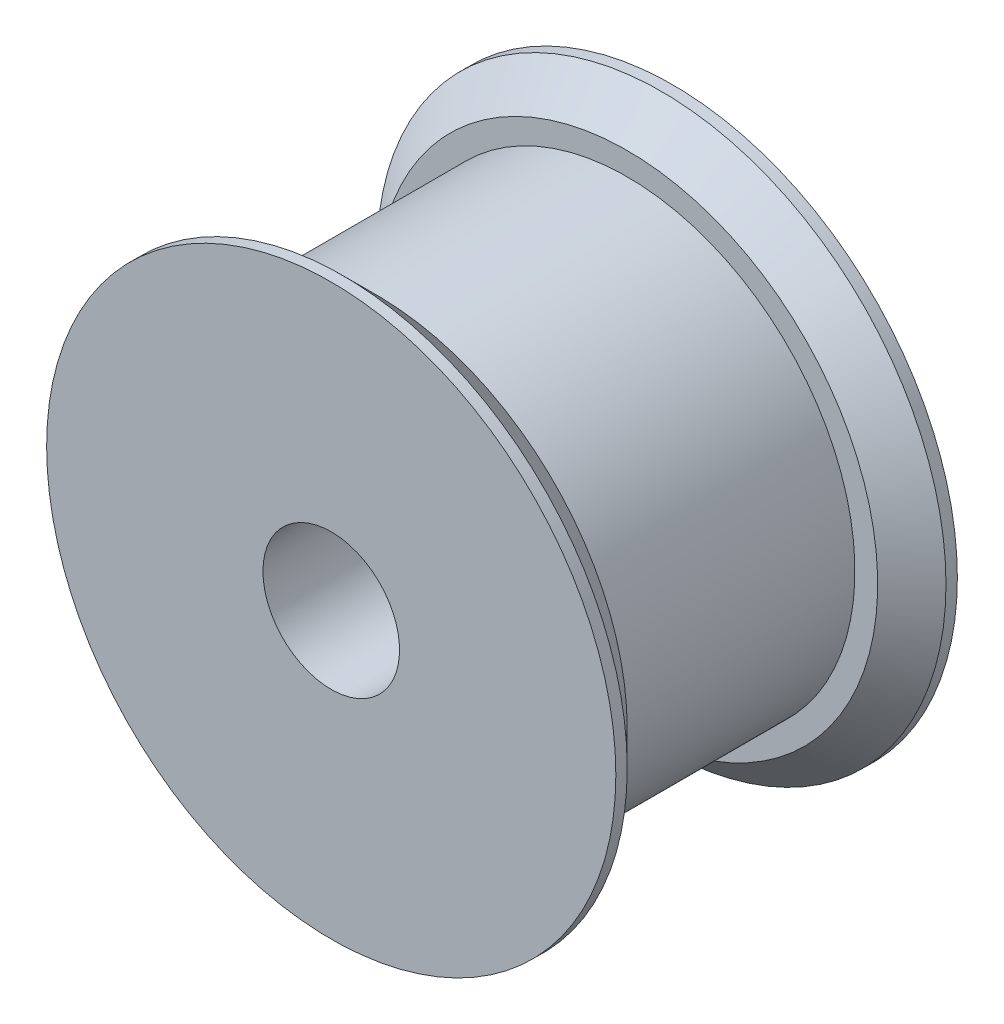
ISO-10303-21;
HEADER;
FILE_DESCRIPTION(('STEP AP214'),'2;1');
FILE_NAME('part.step','',(''),(''),'','','');
FILE_SCHEMA(('AUTOMOTIVE_DESIGN { 1 0 10303 214 1 1 1 1 }'));
ENDSEC;
DATA;
#1=APPLICATION_CONTEXT('core data for automotive mechanical design processes');
#2=APPLICATION_PROTOCOL_DEFINITION('international standard','automotive_design',2000,#1);
#3=PRODUCT_CONTEXT('',#1,'mechanical');
#4=PRODUCT('Part','Part','',(#3));
#5=PRODUCT_RELATED_PRODUCT_CATEGORY('part','',(#4));
#6=PRODUCT_DEFINITION_FORMATION('','',#4);
#7=PRODUCT_DEFINITION_CONTEXT('part definition',#1,'design');
#8=PRODUCT_DEFINITION('design','',#6,#7);
#9=PRODUCT_DEFINITION_SHAPE('','',#8);
#10=(LENGTH_UNIT() NAMED_UNIT(*) SI_UNIT(.MILLI.,.METRE.));
#11=(NAMED_UNIT(*) PLANE_ANGLE_UNIT() SI_UNIT($,.RADIAN.));
#12=(NAMED_UNIT(*) SI_UNIT($,.STERADIAN.) SOLID_ANGLE_UNIT());
#13=UNCERTAINTY_MEASURE_WITH_UNIT(LENGTH_MEASURE(1.E-05),#10,'distance_accuracy_value','');
#14=(GEOMETRIC_REPRESENTATION_CONTEXT(3) GLOBAL_UNCERTAINTY_ASSIGNED_CONTEXT((#13)) GLOBAL_UNIT_ASSIGNED_CONTEXT((#10,
#11,#12)) REPRESENTATION_CONTEXT('',''));
#15=CARTESIAN_POINT('',(0.,0.,0.));
#16=DIRECTION('',(0.,0.,1.));
#17=DIRECTION('',(1.,0.,0.));
#18=AXIS2_PLACEMENT_3D('',#15,#16,#17);
#19=CARTESIAN_POINT('',(0.,0.,7.5));
#20=DIRECTION('',(0.,0.,-1.));
#21=DIRECTION('',(-1.,0.,0.));
#22=AXIS2_PLACEMENT_3D('',#19,#20,#21);
#23=PLANE('',#22);
#24=CARTESIAN_POINT('',(0.,0.,7.5));
#25=DIRECTION('',(0.,0.,-1.));
#26=DIRECTION('',(-1.,0.,0.));
#27=AXIS2_PLACEMENT_3D('',#24,#25,#26);
#28=CIRCLE('',#27,3.);
#29=CARTESIAN_POINT('',(-3.,0.,7.5));
#30=VERTEX_POINT('',#29);
#31=EDGE_CURVE('E80',#30,#30,#28,.T.);
#32=ORIENTED_EDGE('',*,*,#31,.T.);
#33=EDGE_LOOP('',(#32));
#34=FACE_BOUND('',#33,.T.);
#35=CARTESIAN_POINT('',(0.,0.,7.5));
#36=DIRECTION('',(0.,0.,-1.));
#37=DIRECTION('',(-1.,0.,0.));
#38=AXIS2_PLACEMENT_3D('',#35,#36,#37);
#39=CIRCLE('',#38,12.5);
#40=CARTESIAN_POINT('',(-12.5,0.,7.5));
#41=VERTEX_POINT('',#40);
#42=EDGE_CURVE('E64',#41,#41,#39,.T.);
#43=ORIENTED_EDGE('',*,*,#42,.F.);
#44=EDGE_LOOP('',(#43));
#45=FACE_BOUND('',#44,.T.);
#46=ADVANCED_FACE('F39',(#34,#45),#23,.F.);
#47=CARTESIAN_POINT('',(0.,0.,-16.7008196721311));
#48=DIRECTION('',(0.,0.,-1.));
#49=DIRECTION('',(-1.,0.,0.));
#50=AXIS2_PLACEMENT_3D('',#47,#48,#49);
#51=CYLINDRICAL_SURFACE('',#50,12.5);
#52=CARTESIAN_POINT('',(0.,0.,7.00000000000001));
#53=DIRECTION('',(0.,0.,1.));
#54=DIRECTION('',(1.,0.,0.));
#55=AXIS2_PLACEMENT_3D('',#52,#53,#54);
#56=CIRCLE('',#55,12.5);
#57=CARTESIAN_POINT('',(12.5,0.,7.00000000000001));
#58=VERTEX_POINT('',#57);
#59=EDGE_CURVE('E10',#58,#58,#56,.T.);
#60=ORIENTED_EDGE('',*,*,#59,.T.);
#61=EDGE_LOOP('',(#60));
#62=FACE_BOUND('',#61,.T.);
#63=ORIENTED_EDGE('',*,*,#42,.T.);
#64=EDGE_LOOP('',(#63));
#65=FACE_BOUND('',#64,.T.);
#66=ADVANCED_FACE('F116',(#62,#65),#51,.T.);
#67=CARTESIAN_POINT('',(12.5,0.,5.5));
#68=DIRECTION('',(0.,0.,1.));
#69=DIRECTION('',(1.,0.,0.));
#70=AXIS2_PLACEMENT_3D('',#67,#68,#69);
#71=PLANE('',#70);
#72=CARTESIAN_POINT('',(0.,0.,5.5));
#73=DIRECTION('',(0.,0.,1.));
#74=DIRECTION('',(1.,0.,0.));
#75=AXIS2_PLACEMENT_3D('',#72,#73,#74);
#76=CIRCLE('',#75,11.);
#77=CARTESIAN_POINT('',(11.,0.,5.5));
#78=VERTEX_POINT('',#77);
#79=EDGE_CURVE('E48',#78,#78,#76,.F.);
#80=ORIENTED_EDGE('',*,*,#79,.T.);
#81=EDGE_LOOP('',(#80));
#82=FACE_BOUND('',#81,.T.);
#83=CARTESIAN_POINT('',(0.,0.,5.5));
#84=DIRECTION('',(0.,0.,-1.));
#85=DIRECTION('',(-1.,0.,0.));
#86=AXIS2_PLACEMENT_3D('',#83,#84,#85);
#87=CIRCLE('',#86,10.);
#88=CARTESIAN_POINT('',(-10.,0.,5.5));
#89=VERTEX_POINT('',#88);
#90=EDGE_CURVE('E68',#89,#89,#87,.T.);
#91=ORIENTED_EDGE('',*,*,#90,.F.);
#92=EDGE_LOOP('',(#91));
#93=FACE_BOUND('',#92,.T.);
#94=ADVANCED_FACE('F121',(#82,#93),#71,.F.);
#95=CARTESIAN_POINT('',(0.,0.,-16.7008196721311));
#96=DIRECTION('',(0.,0.,-1.));
#97=DIRECTION('',(-1.,0.,0.));
#98=AXIS2_PLACEMENT_3D('',#95,#96,#97);
#99=CYLINDRICAL_SURFACE('',#98,10.);
#100=CARTESIAN_POINT('',(0.,0.,-5.5));
#101=DIRECTION('',(0.,0.,-1.));
#102=DIRECTION('',(-1.,0.,0.));
#103=AXIS2_PLACEMENT_3D('',#100,#101,#102);
#104=CIRCLE('',#103,10.);
#105=CARTESIAN_POINT('',(-10.,0.,-5.5));
#106=VERTEX_POINT('',#105);
#107=EDGE_CURVE('E72',#106,#106,#104,.T.);
#108=ORIENTED_EDGE('',*,*,#107,.F.);
#109=EDGE_LOOP('',(#108));
#110=FACE_BOUND('',#109,.T.);
#111=ORIENTED_EDGE('',*,*,#90,.T.);
#112=EDGE_LOOP('',(#111));
#113=FACE_BOUND('',#112,.T.);
#114=ADVANCED_FACE('F112',(#110,#113),#99,.T.);
#115=CARTESIAN_POINT('',(12.5,0.,-5.5));
#116=DIRECTION('',(0.,0.,-1.));
#117=DIRECTION('',(-1.,0.,0.));
#118=AXIS2_PLACEMENT_3D('',#115,#116,#117);
#119=PLANE('',#118);
#120=CARTESIAN_POINT('',(0.,0.,-5.5));
#121=DIRECTION('',(0.,0.,-1.));
#122=DIRECTION('',(-1.,0.,0.));
#123=AXIS2_PLACEMENT_3D('',#120,#121,#122);
#124=CIRCLE('',#123,11.);
#125=CARTESIAN_POINT('',(-11.,0.,-5.5));
#126=VERTEX_POINT('',#125);
#127=EDGE_CURVE('E53',#126,#126,#124,.F.);
#128=ORIENTED_EDGE('',*,*,#127,.T.);
#129=EDGE_LOOP('',(#128));
#130=FACE_BOUND('',#129,.T.);
#131=ORIENTED_EDGE('',*,*,#107,.T.);
#132=EDGE_LOOP('',(#131));
#133=FACE_BOUND('',#132,.T.);
#134=ADVANCED_FACE('F106',(#130,#133),#119,.F.);
#135=CARTESIAN_POINT('',(0.,0.,-16.7008196721311));
#136=DIRECTION('',(0.,0.,-1.));
#137=DIRECTION('',(-1.,0.,0.));
#138=AXIS2_PLACEMENT_3D('',#135,#136,#137);
#139=CYLINDRICAL_SURFACE('',#138,12.5);
#140=CARTESIAN_POINT('',(0.,0.,-7.));
#141=DIRECTION('',(0.,0.,-1.));
#142=DIRECTION('',(-1.,0.,0.));
#143=AXIS2_PLACEMENT_3D('',#140,#141,#142);
#144=CIRCLE('',#143,12.5);
#145=CARTESIAN_POINT('',(-12.5,0.,-7.));
#146=VERTEX_POINT('',#145);
#147=EDGE_CURVE('E58',#146,#146,#144,.T.);
#148=ORIENTED_EDGE('',*,*,#147,.T.);
#149=EDGE_LOOP('',(#148));
#150=FACE_BOUND('',#149,.T.);
#151=CARTESIAN_POINT('',(0.,0.,-7.5));
#152=DIRECTION('',(0.,0.,-1.));
#153=DIRECTION('',(-1.,0.,0.));
#154=AXIS2_PLACEMENT_3D('',#151,#152,#153);
#155=CIRCLE('',#154,12.5);
#156=CARTESIAN_POINT('',(-12.5,0.,-7.5));
#157=VERTEX_POINT('',#156);
#158=EDGE_CURVE('E76',#157,#157,#155,.T.);
#159=ORIENTED_EDGE('',*,*,#158,.F.);
#160=EDGE_LOOP('',(#159));
#161=FACE_BOUND('',#160,.T.);
#162=ADVANCED_FACE('F101',(#150,#161),#139,.T.);
#163=CARTESIAN_POINT('',(0.,0.,-7.5));
#164=DIRECTION('',(0.,0.,1.));
#165=DIRECTION('',(1.,0.,0.));
#166=AXIS2_PLACEMENT_3D('',#163,#164,#165);
#167=PLANE('',#166);
#168=CARTESIAN_POINT('',(0.,0.,-7.5));
#169=DIRECTION('',(0.,0.,-1.));
#170=DIRECTION('',(-1.,0.,0.));
#171=AXIS2_PLACEMENT_3D('',#168,#169,#170);
#172=CIRCLE('',#171,3.);
#173=CARTESIAN_POINT('',(-3.,0.,-7.5));
#174=VERTEX_POINT('',#173);
#175=EDGE_CURVE('E81',#174,#174,#172,.T.);
#176=ORIENTED_EDGE('',*,*,#175,.F.);
#177=EDGE_LOOP('',(#176));
#178=FACE_BOUND('',#177,.T.);
#179=ORIENTED_EDGE('',*,*,#158,.T.);
#180=EDGE_LOOP('',(#179));
#181=FACE_BOUND('',#180,.T.);
#182=ADVANCED_FACE('F95',(#178,#181),#167,.F.);
#183=CARTESIAN_POINT('',(0.,0.,7.5));
#184=DIRECTION('',(0.,0.,-1.));
#185=DIRECTION('',(-1.,0.,0.));
#186=AXIS2_PLACEMENT_3D('',#183,#184,#185);
#187=CYLINDRICAL_SURFACE('',#186,3.);
#188=ORIENTED_EDGE('',*,*,#31,.F.);
#189=EDGE_LOOP('',(#188));
#190=FACE_BOUND('',#189,.T.);
#191=ORIENTED_EDGE('',*,*,#175,.T.);
#192=EDGE_LOOP('',(#191));
#193=FACE_BOUND('',#192,.T.);
#194=ADVANCED_FACE('F91',(#190,#193),#187,.F.);
#195=CARTESIAN_POINT('',(0.,0.,-7.));
#196=DIRECTION('',(0.,0.,-1.));
#197=DIRECTION('',(-1.,0.,0.));
#198=AXIS2_PLACEMENT_3D('',#195,#196,#197);
#199=CONICAL_SURFACE('',#198,12.5,0.785398163397451);
#200=ORIENTED_EDGE('',*,*,#127,.F.);
#201=EDGE_LOOP('',(#200));
#202=FACE_BOUND('',#201,.T.);
#203=ORIENTED_EDGE('',*,*,#147,.F.);
#204=EDGE_LOOP('',(#203));
#205=FACE_BOUND('',#204,.T.);
#206=ADVANCED_FACE('F94',(#202,#205),#199,.T.);
#207=CARTESIAN_POINT('',(0.,0.,5.5));
#208=DIRECTION('',(0.,0.,1.));
#209=DIRECTION('',(1.,0.,0.));
#210=AXIS2_PLACEMENT_3D('',#207,#208,#209);
#211=CONICAL_SURFACE('',#210,11.,0.785398163397448);
#212=ORIENTED_EDGE('',*,*,#59,.F.);
#213=EDGE_LOOP('',(#212));
#214=FACE_BOUND('',#213,.T.);
#215=ORIENTED_EDGE('',*,*,#79,.F.);
#216=EDGE_LOOP('',(#215));
#217=FACE_BOUND('',#216,.T.);
#218=ADVANCED_FACE('F42',(#214,#217),#211,.T.);
#219=CLOSED_SHELL('',(#46,#66,#94,#114,#134,#162,#182,#194,#206,#218));
#220=MANIFOLD_SOLID_BREP('B2',#219);
#221=ADVANCED_BREP_SHAPE_REPRESENTATION('',(#18,#220),#14);
#222=SHAPE_DEFINITION_REPRESENTATION(#9,#221);
ENDSEC;
END-ISO-10303-21;
